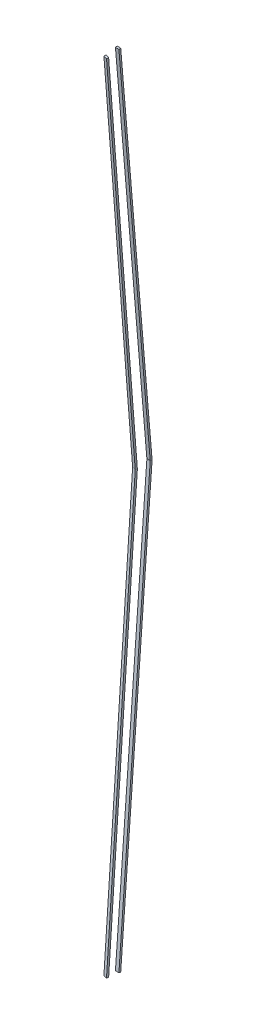
ISO-10303-21;
HEADER;
FILE_DESCRIPTION(('STEP AP214'),'2;1');
FILE_NAME('part.step','',(''),(''),'','','');
FILE_SCHEMA(('AUTOMOTIVE_DESIGN { 1 0 10303 214 1 1 1 1 }'));
ENDSEC;
DATA;
#1=APPLICATION_CONTEXT('core data for automotive mechanical design processes');
#2=APPLICATION_PROTOCOL_DEFINITION('international standard','automotive_design',2000,#1);
#3=PRODUCT_CONTEXT('',#1,'mechanical');
#4=PRODUCT('Part','Part','',(#3));
#5=PRODUCT_RELATED_PRODUCT_CATEGORY('part','',(#4));
#6=PRODUCT_DEFINITION_FORMATION('','',#4);
#7=PRODUCT_DEFINITION_CONTEXT('part definition',#1,'design');
#8=PRODUCT_DEFINITION('design','',#6,#7);
#9=PRODUCT_DEFINITION_SHAPE('','',#8);
#10=(LENGTH_UNIT() NAMED_UNIT(*) SI_UNIT(.MILLI.,.METRE.));
#11=(NAMED_UNIT(*) PLANE_ANGLE_UNIT() SI_UNIT($,.RADIAN.));
#12=(NAMED_UNIT(*) SI_UNIT($,.STERADIAN.) SOLID_ANGLE_UNIT());
#13=UNCERTAINTY_MEASURE_WITH_UNIT(LENGTH_MEASURE(1.E-05),#10,'distance_accuracy_value','');
#14=(GEOMETRIC_REPRESENTATION_CONTEXT(3) GLOBAL_UNCERTAINTY_ASSIGNED_CONTEXT((#13)) GLOBAL_UNIT_ASSIGNED_CONTEXT((#10,
#11,#12)) REPRESENTATION_CONTEXT('',''));
#15=CARTESIAN_POINT('',(0.,0.,0.));
#16=DIRECTION('',(0.,0.,1.));
#17=DIRECTION('',(1.,0.,0.));
#18=AXIS2_PLACEMENT_3D('',#15,#16,#17);
#19=CARTESIAN_POINT('',(-152.237738264979,320.160231668811,42.3905720206934));
#20=DIRECTION('',(3.86128822318415E-12,0.990268068743646,0.1391731009453));
#21=DIRECTION('',(0.,0.1391731009453,-0.990268068743646));
#22=AXIS2_PLACEMENT_3D('',#19,#20,#21);
#23=PLANE('',#22);
#24=DIRECTION('',(0.23455155219263,0.135290683936723,-0.962643236201222));
#25=VECTOR('',#24,1.);
#26=CARTESIAN_POINT('',(-156.061787395011,319.838365349823,44.6807698814717));
#27=LINE('',#26,#25);
#28=CARTESIAN_POINT('',(-156.061787395011,319.838365349823,44.6807698814717));
#29=VERTEX_POINT('',#28);
#30=CARTESIAN_POINT('',(-155.316943565859,320.267995553205,41.6237921405165));
#31=VERTEX_POINT('',#30);
#32=EDGE_CURVE('E211',#29,#31,#27,.T.);
#33=ORIENTED_EDGE('',*,*,#32,.F.);
#34=CARTESIAN_POINT('',(-156.061787395011,319.838365349823,44.6807698814717));
#35=CARTESIAN_POINT('',(-155.53406566862,319.819656879237,44.8138875666285));
#36=CARTESIAN_POINT('',(-155.006125952786,319.801070737595,44.9461348361269));
#37=CARTESIAN_POINT('',(-152.953214172442,319.729307720212,45.4567552371992));
#38=CARTESIAN_POINT('',(-151.426648614079,319.676982817079,45.8290662686723));
#39=CARTESIAN_POINT('',(-149.898323811749,319.625661630601,46.1942354850572));
#40=B_SPLINE_CURVE_WITH_KNOTS('',3,(#34,#35,#36,#37,#38,#39),.UNSPECIFIED.,.F.,.F.,(4,2,4),
(3.46673401728531,3.53112075735775,3.71700152562739),.UNSPECIFIED.);
#41=CARTESIAN_POINT('',(-149.898323811749,319.625661630601,46.1942354850572));
#42=VERTEX_POINT('',#41);
#43=EDGE_CURVE('E188',#29,#42,#40,.T.);
#44=ORIENTED_EDGE('',*,*,#43,.T.);
#45=DIRECTION('',(0.234551552192062,0.135290683936786,-0.962643236201351));
#46=VECTOR('',#45,1.);
#47=CARTESIAN_POINT('',(-149.898323811749,319.625661630601,46.1942354850572));
#48=LINE('',#47,#46);
#49=CARTESIAN_POINT('',(-149.153622633539,320.0552095521,43.1378432101179));
#50=VERTEX_POINT('',#49);
#51=EDGE_CURVE('E199',#42,#50,#48,.T.);
#52=ORIENTED_EDGE('',*,*,#51,.T.);
#53=CARTESIAN_POINT('',(-155.316943565859,320.267995553205,41.6237921405165));
#54=CARTESIAN_POINT('',(-153.265770191254,320.195241555838,42.141463730562));
#55=CARTESIAN_POINT('',(-151.211343115558,320.124307859224,42.6461832077424));
#56=CARTESIAN_POINT('',(-149.153622633539,320.0552095521,43.1378432101179));
#57=B_SPLINE_CURVE_WITH_KNOTS('',3,(#53,#54,#55,#56),.UNSPECIFIED.,.F.,.F.,(4,4),
(3.46513247858125,3.71700152562739),.UNSPECIFIED.);
#58=EDGE_CURVE('E206',#31,#50,#57,.T.);
#59=ORIENTED_EDGE('',*,*,#58,.F.);
#60=EDGE_LOOP('',(#33,#44,#52,#59));
#61=FACE_BOUND('',#60,.T.);
#62=ADVANCED_FACE('F144',(#61),#23,.T.);
#63=CARTESIAN_POINT('',(-201.824302837777,-390.348529640337,-58.4461827906793));
#64=DIRECTION('',(0.,1.,0.));
#65=DIRECTION('',(0.,0.,-1.));
#66=AXIS2_PLACEMENT_3D('',#63,#64,#65);
#67=PLANE('',#66);
#68=DIRECTION('',(0.237326491207853,0.,-0.971429944242491));
#69=VECTOR('',#68,1.);
#70=CARTESIAN_POINT('',(-205.660848265567,-390.348529640337,-56.1398266287337));
#71=LINE('',#70,#69);
#72=CARTESIAN_POINT('',(-205.660848265567,-390.348529640337,-56.1398266287337));
#73=VERTEX_POINT('',#72);
#74=CARTESIAN_POINT('',(-204.907300304975,-390.348529640337,-59.2242654944347));
#75=VERTEX_POINT('',#74);
#76=EDGE_CURVE('E290',#73,#75,#71,.T.);
#77=ORIENTED_EDGE('',*,*,#76,.T.);
#78=CARTESIAN_POINT('',(-204.907300304975,-390.348529640337,-59.2242654944347));
#79=CARTESIAN_POINT('',(-202.850160939919,-390.348529640337,-58.7016411425626));
#80=CARTESIAN_POINT('',(-200.796637160963,-390.348529640337,-58.1852697945496));
#81=CARTESIAN_POINT('',(-198.746728094591,-390.348529640337,-57.6844640196631));
#82=B_SPLINE_CURVE_WITH_KNOTS('',3,(#78,#79,#80,#81),.UNSPECIFIED.,.F.,.F.,(4,4),
(5.14385179955999,5.39514400114973),.UNSPECIFIED.);
#83=CARTESIAN_POINT('',(-198.746728094591,-390.348529640337,-57.6844640196631));
#84=VERTEX_POINT('',#83);
#85=EDGE_CURVE('E284',#75,#84,#82,.T.);
#86=ORIENTED_EDGE('',*,*,#85,.T.);
#87=DIRECTION('',(0.237326491188107,0.,-0.971429944247315));
#88=VECTOR('',#87,1.);
#89=CARTESIAN_POINT('',(-199.500239704113,-390.348529640337,-54.6001739466776));
#90=LINE('',#89,#88);
#91=CARTESIAN_POINT('',(-199.500239704115,-390.348529640337,-54.600173946678));
#92=VERTEX_POINT('',#91);
#93=EDGE_CURVE('E155',#92,#84,#90,.T.);
#94=ORIENTED_EDGE('',*,*,#93,.F.);
#95=CARTESIAN_POINT('',(-205.660848265567,-390.348529640337,-56.1398266287337));
#96=CARTESIAN_POINT('',(-203.60810992003,-390.348529640337,-55.6183663203144));
#97=CARTESIAN_POINT('',(-201.554588896225,-390.348529640337,-55.102064472419));
#98=CARTESIAN_POINT('',(-199.500239704115,-390.348529640337,-54.600173946678));
#99=B_SPLINE_CURVE_WITH_KNOTS('',3,(#95,#96,#97,#98),.UNSPECIFIED.,.F.,.F.,(4,4),
(5.14499955782916,5.39514400114973),.UNSPECIFIED.);
#100=EDGE_CURVE('E14',#73,#92,#99,.T.);
#101=ORIENTED_EDGE('',*,*,#100,.F.);
#102=EDGE_LOOP('',(#77,#86,#94,#101));
#103=FACE_BOUND('',#102,.T.);
#104=ADVANCED_FACE('F250',(#103),#67,.F.);
#105=CARTESIAN_POINT('',(-205.660848265567,-390.348529640337,-56.1398266287337));
#106=CARTESIAN_POINT('',(-156.061787395011,319.838365349823,44.6807698814717));
#107=CARTESIAN_POINT('',(-205.535256938801,-390.348529640337,-56.6538997730172));
#108=CARTESIAN_POINT('',(-155.937646756819,319.90997038372,44.1712735913124));
#109=CARTESIAN_POINT('',(-205.409665612036,-390.348529640337,-57.1679729173007));
#110=CARTESIAN_POINT('',(-155.813506118627,319.981575417617,43.6617773011532));
#111=CARTESIAN_POINT('',(-205.158482958505,-390.348529640337,-58.1961192058677));
#112=CARTESIAN_POINT('',(-155.565224842243,320.124785485411,42.6427847208348));
#113=CARTESIAN_POINT('',(-205.03289163174,-390.348529640337,-58.7101923501512));
#114=CARTESIAN_POINT('',(-155.441084204051,320.196390519308,42.1332884306756));
#115=CARTESIAN_POINT('',(-204.907300304975,-390.348529640337,-59.2242654944347));
#116=CARTESIAN_POINT('',(-155.316943565859,320.267995553205,41.6237921405165));
#117=B_SPLINE_SURFACE_WITH_KNOTS('',3,1,((#105,#106),(#107,#108),(#109,#110),(#111,#112),(#113,
#114),(#115,#116)),.UNSPECIFIED.,.F.,.F.,.F.,(4,2,4),(2,2),(0.,0.5,1.),(0.,1.),.UNSPECIFIED.);
#118=DIRECTION('',(-0.0689814409750572,-0.987714576005323,-0.140219389342662));
#119=VECTOR('',#118,1.);
#120=CARTESIAN_POINT('',(-180.861317830289,-35.2550821452571,-5.72952837363101));
#121=LINE('',#120,#119);
#122=EDGE_CURVE('E179',#29,#73,#121,.T.);
#123=DIRECTION('',(0.0689283435027476,0.987724694237461,0.140174219653553));
#124=VECTOR('',#123,1.);
#125=CARTESIAN_POINT('',(-180.112121935417,-35.0402670435662,-8.80023667695908));
#126=LINE('',#125,#124);
#127=EDGE_CURVE('E164',#75,#31,#126,.T.);
#128=ORIENTED_EDGE('',*,*,#76,.F.);
#129=ORIENTED_EDGE('',*,*,#122,.F.);
#130=ORIENTED_EDGE('',*,*,#32,.T.);
#131=ORIENTED_EDGE('',*,*,#127,.F.);
#132=EDGE_LOOP('',(#128,#129,#130,#131));
#133=FACE_BOUND('',#132,.T.);
#134=ADVANCED_FACE('F259',(#133),#117,.F.);
#135=CARTESIAN_POINT('',(-204.907300304975,-390.348529640337,-59.2242654944347));
#136=CARTESIAN_POINT('',(-155.316943565859,320.267995553205,41.6237921405165));
#137=CARTESIAN_POINT('',(-203.881526156514,-390.348529640337,-58.9636635349306));
#138=CARTESIAN_POINT('',(-154.291347612634,320.231618225864,41.8826302740567));
#139=CARTESIAN_POINT('',(-202.855350610006,-390.348529640337,-58.7046735299587));
#140=CARTESIAN_POINT('',(-153.264940707668,320.195696754155,42.1382248262377));
#141=CARTESIAN_POINT('',(-200.802196720892,-390.348529640337,-58.1899174290792));
#142=CARTESIAN_POINT('',(-151.210504994252,320.124765522,42.6429267678813));
#143=CARTESIAN_POINT('',(-199.774848197273,-390.348529640337,-57.9356402757939));
#144=CARTESIAN_POINT('',(-150.182471588445,320.089758326674,42.8920159055674));
#145=CARTESIAN_POINT('',(-198.746728094591,-390.348529640337,-57.6844640196631));
#146=CARTESIAN_POINT('',(-149.153622633539,320.0552095521,43.1378432101179));
#147=B_SPLINE_SURFACE_WITH_KNOTS('',3,1,((#135,#136),(#137,#138),(#139,#140),(#141,#142),(#143,
#144),(#145,#146)),.UNSPECIFIED.,.F.,.F.,.F.,(4,2,4),(2,2),(0.,0.5,1.),(0.,1.),.UNSPECIFIED.);
#148=DIRECTION('',(0.0689526351551819,0.987722171983838,0.140180045215732));
#149=VECTOR('',#148,1.);
#150=CARTESIAN_POINT('',(-173.950175364065,-35.1466600441185,-7.27331040477257));
#151=LINE('',#150,#149);
#152=EDGE_CURVE('E196',#84,#50,#151,.T.);
#153=ORIENTED_EDGE('',*,*,#85,.F.);
#154=ORIENTED_EDGE('',*,*,#127,.T.);
#155=ORIENTED_EDGE('',*,*,#58,.T.);
#156=ORIENTED_EDGE('',*,*,#152,.F.);
#157=EDGE_LOOP('',(#153,#154,#155,#156));
#158=FACE_BOUND('',#157,.T.);
#159=ADVANCED_FACE('F333',(#158),#147,.F.);
#160=CARTESIAN_POINT('',(-199.500239704115,-390.348529640337,-54.600173946678));
#161=CARTESIAN_POINT('',(-149.898323811749,319.625661630601,46.1942354850572));
#162=CARTESIAN_POINT('',(-200.528360133361,-390.348529640337,-54.8513502825908));
#163=CARTESIAN_POINT('',(-150.927179241401,319.660210622598,45.9484066334631));
#164=CARTESIAN_POINT('',(-201.555713745134,-390.348529640337,-55.1056081298554));
#165=CARTESIAN_POINT('',(-151.955232248758,319.695208583692,45.699383200744));
#166=CARTESIAN_POINT('',(-203.608887333733,-390.348529640337,-55.6202868470884));
#167=CARTESIAN_POINT('',(-154.00973341888,319.766102444078,45.1949471730558));
#168=CARTESIAN_POINT('',(-204.635069909111,-390.348529640337,-55.879246560509));
#169=CARTESIAN_POINT('',(-155.036168272611,319.802005722723,44.9394820712464));
#170=CARTESIAN_POINT('',(-205.660848265567,-390.348529640337,-56.1398266287337));
#171=CARTESIAN_POINT('',(-156.061787395011,319.838365349823,44.6807698814717));
#172=B_SPLINE_SURFACE_WITH_KNOTS('',3,1,((#160,#161),(#162,#163),(#164,#165),(#166,#167),(#168,
#169),(#170,#171)),.UNSPECIFIED.,.F.,.F.,.F.,(4,2,4),(2,2),(0.,0.5,1.),(0.,1.),.UNSPECIFIED.);
#173=DIRECTION('',(0.0690059080028812,0.987712124539221,0.140224618733363));
#174=VECTOR('',#173,1.);
#175=CARTESIAN_POINT('',(-174.699281757931,-35.3614340048681,-4.20296923081019));
#176=LINE('',#175,#174);
#177=EDGE_CURVE('E184',#92,#42,#176,.T.);
#178=ORIENTED_EDGE('',*,*,#100,.T.);
#179=ORIENTED_EDGE('',*,*,#177,.T.);
#180=ORIENTED_EDGE('',*,*,#43,.F.);
#181=ORIENTED_EDGE('',*,*,#122,.T.);
#182=EDGE_LOOP('',(#178,#179,#180,#181));
#183=FACE_BOUND('',#182,.T.);
#184=ADVANCED_FACE('F186',(#183),#172,.F.);
#185=CARTESIAN_POINT('',(-198.746728094591,-390.348529640337,-57.6844640196631));
#186=CARTESIAN_POINT('',(-149.153622633539,320.0552095521,43.1378432101179));
#187=CARTESIAN_POINT('',(-198.872313362844,-390.348529640337,-57.1704156741655));
#188=CARTESIAN_POINT('',(-149.277739496574,319.98361823185,43.6472419226078));
#189=CARTESIAN_POINT('',(-198.997898631098,-390.348529640337,-56.6563673286679));
#190=CARTESIAN_POINT('',(-149.401856359609,319.9120269116,44.1566406350976));
#191=CARTESIAN_POINT('',(-199.249069167606,-390.348529640337,-55.6282706376728));
#192=CARTESIAN_POINT('',(-149.650090085679,319.768844271101,45.1754380600774));
#193=CARTESIAN_POINT('',(-199.374654435859,-390.348529640337,-55.1142222921752));
#194=CARTESIAN_POINT('',(-149.774206948714,319.69725295085,45.6848367725673));
#195=CARTESIAN_POINT('',(-199.500239704113,-390.348529640337,-54.6001739466776));
#196=CARTESIAN_POINT('',(-149.898323811749,319.625661630601,46.1942354850572));
#197=B_SPLINE_SURFACE_WITH_KNOTS('',3,1,((#185,#186),(#187,#188),(#189,#190),(#191,#192),(#193,
#194),(#195,#196)),.UNSPECIFIED.,.F.,.F.,.F.,(4,2,4),(2,2),(0.,0.5,1.),(0.,1.),.UNSPECIFIED.);
#198=ORIENTED_EDGE('',*,*,#93,.T.);
#199=ORIENTED_EDGE('',*,*,#152,.T.);
#200=ORIENTED_EDGE('',*,*,#51,.F.);
#201=ORIENTED_EDGE('',*,*,#177,.F.);
#202=EDGE_LOOP('',(#198,#199,#200,#201));
#203=FACE_BOUND('',#202,.T.);
#204=ADVANCED_FACE('F201',(#203),#197,.F.);
#205=CLOSED_SHELL('',(#62,#104,#134,#159,#184,#204));
#206=MANIFOLD_SOLID_BREP('B2',#205);
#207=CARTESIAN_POINT('',(-153.140507570127,322.756182568553,23.9194215879336));
#208=DIRECTION('',(-7.40505947866751E-13,-0.990268068746311,-0.139173100926337));
#209=DIRECTION('',(0.,-0.139173100926337,0.990268068746311));
#210=AXIS2_PLACEMENT_3D('',#207,#208,#209);
#211=PLANE('',#210);
#212=DIRECTION('',(-0.0214353868944192,-0.139141123950179,0.990040540490422));
#213=VECTOR('',#212,1.);
#214=CARTESIAN_POINT('',(-149.898323811758,323.188063599809,20.8464283744718));
#215=LINE('',#214,#213);
#216=CARTESIAN_POINT('',(-149.898323811758,323.188063599809,20.8464283744718));
#217=VERTEX_POINT('',#216);
#218=CARTESIAN_POINT('',(-149.966381165148,322.746290531268,23.9898070905284));
#219=VERTEX_POINT('',#218);
#220=EDGE_CURVE('E559',#217,#219,#215,.T.);
#221=ORIENTED_EDGE('',*,*,#220,.F.);
#222=CARTESIAN_POINT('',(-149.898323811758,323.188063599809,20.8464283744718));
#223=CARTESIAN_POINT('',(-152.014492368924,323.194378066617,20.8014986085389));
#224=CARTESIAN_POINT('',(-154.130594049607,323.201249849024,20.7526033360559));
#225=CARTESIAN_POINT('',(-156.246603060116,323.208706163198,20.6995489039482));
#226=B_SPLINE_CURVE_WITH_KNOTS('',3,(#222,#223,#224,#225),.UNSPECIFIED.,.F.,.F.,(4,4),
(16.9060793124062,17.1560011004309),.UNSPECIFIED.);
#227=CARTESIAN_POINT('',(-156.246603060116,323.208706163198,20.6995489039482));
#228=VERTEX_POINT('',#227);
#229=EDGE_CURVE('E565',#217,#228,#226,.T.);
#230=ORIENTED_EDGE('',*,*,#229,.T.);
#231=DIRECTION('',(-0.0214353868952497,-0.139141123950234,0.990040540490397));
#232=VECTOR('',#231,1.);
#233=CARTESIAN_POINT('',(-156.246603060116,323.208706163198,20.6995489039482));
#234=LINE('',#233,#232);
#235=CARTESIAN_POINT('',(-156.314660926212,322.766929766595,23.8429513003828));
#236=VERTEX_POINT('',#235);
#237=EDGE_CURVE('E573',#228,#236,#234,.T.);
#238=ORIENTED_EDGE('',*,*,#237,.T.);
#239=CARTESIAN_POINT('',(-149.966381165148,322.746290531268,23.9898070905284));
#240=CARTESIAN_POINT('',(-152.08245217296,322.752604706996,23.9448793957298));
#241=CARTESIAN_POINT('',(-154.198553983593,322.759475376525,23.8959920417892));
#242=CARTESIAN_POINT('',(-156.314660926212,322.766929766595,23.8429513003828));
#243=B_SPLINE_CURVE_WITH_KNOTS('',3,(#239,#240,#241,#242),.UNSPECIFIED.,.F.,.F.,(4,4),
(16.9060793124062,17.1555176068426),.UNSPECIFIED.);
#244=EDGE_CURVE('E578',#219,#236,#243,.T.);
#245=ORIENTED_EDGE('',*,*,#244,.F.);
#246=EDGE_LOOP('',(#221,#230,#238,#245));
#247=FACE_BOUND('',#246,.T.);
#248=ADVANCED_FACE('F510',(#247),#211,.F.);
#249=CARTESIAN_POINT('',(-202.669192099467,-390.348529640337,-84.9138171812578));
#250=DIRECTION('',(0.,-1.,0.));
#251=DIRECTION('',(0.,0.,1.));
#252=AXIS2_PLACEMENT_3D('',#249,#250,#251);
#253=PLANE('',#252);
#254=DIRECTION('',(0.0588207490144278,0.,-0.998268560801842));
#255=VECTOR('',#254,1.);
#256=CARTESIAN_POINT('',(-199.686995582296,-390.348529640337,-81.5523324363946));
#257=LINE('',#256,#255);
#258=CARTESIAN_POINT('',(-199.686995582296,-390.348529640337,-81.5523324363946));
#259=VERTEX_POINT('',#258);
#260=CARTESIAN_POINT('',(-199.500239704175,-390.348529640337,-84.7218351169399));
#261=VERTEX_POINT('',#260);
#262=EDGE_CURVE('E562',#259,#261,#257,.T.);
#263=ORIENTED_EDGE('',*,*,#262,.F.);
#264=CARTESIAN_POINT('',(-199.686995582296,-390.348529640337,-81.5523324363946));
#265=CARTESIAN_POINT('',(-201.800280390277,-390.348529640337,-81.6768530315202));
#266=CARTESIAN_POINT('',(-203.913024823059,-390.348529640337,-81.8105413754247));
#267=CARTESIAN_POINT('',(-206.024578484168,-390.348529640337,-81.9499852711155));
#268=B_SPLINE_CURVE_WITH_KNOTS('',3,(#264,#265,#266,#267),.UNSPECIFIED.,.F.,.F.,(4,4),
(24.9150323256318,25.164217691229),.UNSPECIFIED.);
#269=CARTESIAN_POINT('',(-206.024578484168,-390.348529640337,-81.9499852711155));
#270=VERTEX_POINT('',#269);
#271=EDGE_CURVE('E142',#259,#270,#268,.T.);
#272=ORIENTED_EDGE('',*,*,#271,.T.);
#273=DIRECTION('',(0.0588207490143727,0.,-0.998268560801846));
#274=VECTOR('',#273,1.);
#275=CARTESIAN_POINT('',(-206.024578484168,-390.348529640337,-81.9499852711155));
#276=LINE('',#275,#274);
#277=CARTESIAN_POINT('',(-205.837870398832,-390.348529640337,-85.1186768427457));
#278=VERTEX_POINT('',#277);
#279=EDGE_CURVE('E521',#270,#278,#276,.T.);
#280=ORIENTED_EDGE('',*,*,#279,.T.);
#281=CARTESIAN_POINT('',(-199.500239704175,-390.348529640337,-84.7218351169399));
#282=CARTESIAN_POINT('',(-201.612912424974,-390.348529640337,-84.8463196461934));
#283=CARTESIAN_POINT('',(-203.725563139268,-390.348529640337,-84.9770221839322));
#284=CARTESIAN_POINT('',(-205.837870398832,-390.348529640337,-85.1186768427457));
#285=B_SPLINE_CURVE_WITH_KNOTS('',3,(#281,#282,#283,#284),.UNSPECIFIED.,.F.,.F.,(4,4),
(24.9150323256318,25.1648764359603),.UNSPECIFIED.);
#286=EDGE_CURVE('E671',#261,#278,#285,.T.);
#287=ORIENTED_EDGE('',*,*,#286,.F.);
#288=EDGE_LOOP('',(#263,#272,#280,#287));
#289=FACE_BOUND('',#288,.T.);
#290=ADVANCED_FACE('F735',(#289),#253,.T.);
#291=CARTESIAN_POINT('',(-199.686995582296,-390.348529640337,-81.5523324363946));
#292=CARTESIAN_POINT('',(-149.966381165148,322.746290531268,23.9898070905284));
#293=CARTESIAN_POINT('',(-200.743509782737,-390.348529640337,-81.6145851798491));
#294=CARTESIAN_POINT('',(-151.024475127435,322.749447793566,23.9673420019608));
#295=CARTESIAN_POINT('',(-201.799890015471,-390.348529640337,-81.6789888654246));
#296=CARTESIAN_POINT('',(-152.082545613498,322.752745231326,23.9438795131623));
#297=CARTESIAN_POINT('',(-203.912382545523,-390.348529640337,-81.812098120817));
#298=CARTESIAN_POINT('',(-154.198639633173,322.759620457768,23.8949597351037));
#299=CARTESIAN_POINT('',(-204.968529946747,-390.348529640337,-81.8802453801486));
#300=CARTESIAN_POINT('',(-155.256662400799,322.763202765118,23.8694702938536));
#301=CARTESIAN_POINT('',(-206.024578484168,-390.348529640337,-81.9499852711155));
#302=CARTESIAN_POINT('',(-156.314660926212,322.766929766595,23.8429513003828));
#303=B_SPLINE_SURFACE_WITH_KNOTS('',3,1,((#291,#292),(#293,#294),(#295,#296),(#297,#298),(#299,
#300),(#301,#302)),.UNSPECIFIED.,.F.,.F.,.F.,(4,2,4),(2,2),(0.,0.5,1.),(0.,1.),.UNSPECIFIED.);
#304=DIRECTION('',(-0.0688102588261489,-0.986879179165405,-0.146063801162691));
#305=VECTOR('',#304,1.);
#306=CARTESIAN_POINT('',(-174.826688373722,-33.8011195545347,-28.7812626729331));
#307=LINE('',#306,#305);
#308=EDGE_CURVE('E667',#219,#259,#307,.T.);
#309=DIRECTION('',(0.0687900945897061,0.986830844142769,0.146399480650748));
#310=VECTOR('',#309,1.);
#311=CARTESIAN_POINT('',(-181.16961970519,-33.7907999368707,-29.0535169853663));
#312=LINE('',#311,#310);
#313=EDGE_CURVE('E530',#270,#236,#312,.T.);
#314=ORIENTED_EDGE('',*,*,#271,.F.);
#315=ORIENTED_EDGE('',*,*,#308,.F.);
#316=ORIENTED_EDGE('',*,*,#244,.T.);
#317=ORIENTED_EDGE('',*,*,#313,.F.);
#318=EDGE_LOOP('',(#314,#315,#316,#317));
#319=FACE_BOUND('',#318,.T.);
#320=ADVANCED_FACE('F641',(#319),#303,.F.);
#321=CARTESIAN_POINT('',(-206.024578484168,-390.348529640337,-81.9499852711155));
#322=CARTESIAN_POINT('',(-156.314660926212,322.766929766595,23.8429513003828));
#323=CARTESIAN_POINT('',(-205.993460469945,-390.348529640337,-82.4781005330538));
#324=CARTESIAN_POINT('',(-156.30331794853,322.840559166029,23.3190509009771));
#325=CARTESIAN_POINT('',(-205.962342455722,-390.348529640337,-83.0062157949922));
#326=CARTESIAN_POINT('',(-156.291974970847,322.914188565463,22.7951505015714));
#327=CARTESIAN_POINT('',(-205.900106427277,-390.348529640337,-84.062446318869));
#328=CARTESIAN_POINT('',(-156.269289015481,323.06144736433,21.7473497027598));
#329=CARTESIAN_POINT('',(-205.868988413054,-390.348529640337,-84.5905615808074));
#330=CARTESIAN_POINT('',(-156.257946037799,323.135076763764,21.223449303354));
#331=CARTESIAN_POINT('',(-205.837870398832,-390.348529640337,-85.1186768427457));
#332=CARTESIAN_POINT('',(-156.246603060116,323.208706163198,20.6995489039482));
#333=B_SPLINE_SURFACE_WITH_KNOTS('',3,1,((#321,#322),(#323,#324),(#325,#326),(#327,#328),(#329,
#330),(#331,#332)),.UNSPECIFIED.,.F.,.F.,.F.,(4,2,4),(2,2),(0.,0.5,1.),(0.,1.),.UNSPECIFIED.);
#334=DIRECTION('',(0.0685849477196162,0.986852894447658,0.146347086293429));
#335=VECTOR('',#334,1.);
#336=CARTESIAN_POINT('',(-181.042236729474,-33.5699117385697,-32.2095639693988));
#337=LINE('',#336,#335);
#338=EDGE_CURVE('E550',#278,#228,#337,.T.);
#339=ORIENTED_EDGE('',*,*,#279,.F.);
#340=ORIENTED_EDGE('',*,*,#313,.T.);
#341=ORIENTED_EDGE('',*,*,#237,.F.);
#342=ORIENTED_EDGE('',*,*,#338,.F.);
#343=EDGE_LOOP('',(#339,#340,#341,#342));
#344=FACE_BOUND('',#343,.T.);
#345=ADVANCED_FACE('F616',(#344),#333,.F.);
#346=CARTESIAN_POINT('',(-199.500239704175,-390.348529640337,-84.7218351169399));
#347=CARTESIAN_POINT('',(-149.898323811758,323.188063599809,20.8464283744718));
#348=CARTESIAN_POINT('',(-199.531365683862,-390.348529640337,-84.1935846701824));
#349=CARTESIAN_POINT('',(-149.90966670399,323.114434755052,21.3703248271479));
#350=CARTESIAN_POINT('',(-199.562491663548,-390.348529640337,-83.6653342234248));
#351=CARTESIAN_POINT('',(-149.921009596221,323.040805910295,21.894221279824));
#352=CARTESIAN_POINT('',(-199.624743622922,-390.348529640337,-82.6088333299097));
#353=CARTESIAN_POINT('',(-149.943695380685,322.893548220781,22.9420141851762));
#354=CARTESIAN_POINT('',(-199.655869602609,-390.348529640337,-82.0805828831521));
#355=CARTESIAN_POINT('',(-149.955038272916,322.819919376024,23.4659106378523));
#356=CARTESIAN_POINT('',(-199.686995582296,-390.348529640337,-81.5523324363946));
#357=CARTESIAN_POINT('',(-149.966381165148,322.746290531268,23.9898070905284));
#358=B_SPLINE_SURFACE_WITH_KNOTS('',3,1,((#346,#347),(#348,#349),(#350,#351),(#352,#353),(#354,
#355),(#356,#357)),.UNSPECIFIED.,.F.,.F.,.F.,(4,2,4),(2,2),(0.,0.5,1.),(0.,1.),.UNSPECIFIED.);
#359=DIRECTION('',(0.0686050052000333,0.986901026077874,0.146012732280248));
#360=VECTOR('',#359,1.);
#361=CARTESIAN_POINT('',(-174.699281757966,-33.5802330202638,-31.9377033712341));
#362=LINE('',#361,#360);
#363=EDGE_CURVE('E556',#261,#217,#362,.T.);
#364=ORIENTED_EDGE('',*,*,#262,.T.);
#365=ORIENTED_EDGE('',*,*,#363,.T.);
#366=ORIENTED_EDGE('',*,*,#220,.T.);
#367=ORIENTED_EDGE('',*,*,#308,.T.);
#368=EDGE_LOOP('',(#364,#365,#366,#367));
#369=FACE_BOUND('',#368,.T.);
#370=ADVANCED_FACE('F557',(#369),#358,.F.);
#371=CARTESIAN_POINT('',(-205.837870398832,-390.348529640337,-85.1186768427457));
#372=CARTESIAN_POINT('',(-156.246603060116,323.208706163198,20.6995489039482));
#373=CARTESIAN_POINT('',(-204.781894495133,-390.348529640337,-85.0478614319306));
#374=CARTESIAN_POINT('',(-155.188605013559,323.20497802887,20.7260759580639));
#375=CARTESIAN_POINT('',(-203.725758335003,-390.348529640337,-84.9795805392148));
#376=CARTESIAN_POINT('',(-154.130582530547,323.201394883868,20.7515713595181));
#377=CARTESIAN_POINT('',(-201.613165501885,-390.348529640337,-84.8480877899818));
#378=CARTESIAN_POINT('',(-152.014488691615,323.194518572518,20.8004988571032));
#379=CARTESIAN_POINT('',(-200.556758097128,-390.348529640337,-84.784088107429));
#380=CARTESIAN_POINT('',(-150.95641809184,323.191220863057,20.8239632791569));
#381=CARTESIAN_POINT('',(-199.500239704175,-390.348529640337,-84.7218351169399));
#382=CARTESIAN_POINT('',(-149.898323811758,323.188063599809,20.8464283744718));
#383=B_SPLINE_SURFACE_WITH_KNOTS('',3,1,((#371,#372),(#373,#374),(#375,#376),(#377,#378),(#379,
#380),(#381,#382)),.UNSPECIFIED.,.F.,.F.,.F.,(4,2,4),(2,2),(0.,0.5,1.),(0.,1.),.UNSPECIFIED.);
#384=ORIENTED_EDGE('',*,*,#286,.T.);
#385=ORIENTED_EDGE('',*,*,#338,.T.);
#386=ORIENTED_EDGE('',*,*,#229,.F.);
#387=ORIENTED_EDGE('',*,*,#363,.F.);
#388=EDGE_LOOP('',(#384,#385,#386,#387));
#389=FACE_BOUND('',#388,.T.);
#390=ADVANCED_FACE('F569',(#389),#383,.F.);
#391=CLOSED_SHELL('',(#248,#290,#320,#345,#370,#390));
#392=MANIFOLD_SOLID_BREP('B8',#391);
#393=CARTESIAN_POINT('',(-153.140507570127,-1103.45324184923,23.9194215879336));
#394=DIRECTION('',(-7.40505947866751E-13,0.990268068746311,-0.139173100926337));
#395=DIRECTION('',(0.,0.139173100926337,0.990268068746311));
#396=AXIS2_PLACEMENT_3D('',#393,#394,#395);
#397=PLANE('',#396);
#398=DIRECTION('',(-0.0214353868944192,0.139141123950179,0.990040540490422));
#399=VECTOR('',#398,1.);
#400=CARTESIAN_POINT('',(-149.898323811758,-1103.88512288048,20.8464283744718));
#401=LINE('',#400,#399);
#402=CARTESIAN_POINT('',(-149.898323811758,-1103.88512288048,20.8464283744718));
#403=VERTEX_POINT('',#402);
#404=CARTESIAN_POINT('',(-149.966381165148,-1103.44334981194,23.9898070905284));
#405=VERTEX_POINT('',#404);
#406=EDGE_CURVE('E921',#403,#405,#401,.T.);
#407=ORIENTED_EDGE('',*,*,#406,.T.);
#408=CARTESIAN_POINT('',(-149.966381165148,-1103.44334981194,23.9898070905284));
#409=CARTESIAN_POINT('',(-152.08245217296,-1103.44966398767,23.9448793957298));
#410=CARTESIAN_POINT('',(-154.198553983593,-1103.4565346572,23.8959920417892));
#411=CARTESIAN_POINT('',(-156.314660926212,-1103.46398904727,23.8429513003828));
#412=B_SPLINE_CURVE_WITH_KNOTS('',3,(#408,#409,#410,#411),.UNSPECIFIED.,.F.,.F.,(4,4),
(16.9060793124062,17.1555176068426),.UNSPECIFIED.);
#413=CARTESIAN_POINT('',(-156.314660926212,-1103.46398904727,23.8429513003828));
#414=VERTEX_POINT('',#413);
#415=EDGE_CURVE('E940',#405,#414,#412,.T.);
#416=ORIENTED_EDGE('',*,*,#415,.T.);
#417=DIRECTION('',(-0.0214353868952497,0.139141123950234,0.990040540490397));
#418=VECTOR('',#417,1.);
#419=CARTESIAN_POINT('',(-156.246603060116,-1103.90576544387,20.6995489039482));
#420=LINE('',#419,#418);
#421=CARTESIAN_POINT('',(-156.246603060116,-1103.90576544387,20.6995489039482));
#422=VERTEX_POINT('',#421);
#423=EDGE_CURVE('E922',#422,#414,#420,.T.);
#424=ORIENTED_EDGE('',*,*,#423,.F.);
#425=CARTESIAN_POINT('',(-149.898323811758,-1103.88512288048,20.8464283744718));
#426=CARTESIAN_POINT('',(-152.014492368924,-1103.89143734729,20.8014986085389));
#427=CARTESIAN_POINT('',(-154.130594049607,-1103.8983091297,20.7526033360559));
#428=CARTESIAN_POINT('',(-156.246603060116,-1103.90576544387,20.6995489039482));
#429=B_SPLINE_CURVE_WITH_KNOTS('',3,(#425,#426,#427,#428),.UNSPECIFIED.,.F.,.F.,(4,4),
(16.9060793124062,17.1560011004309),.UNSPECIFIED.);
#430=EDGE_CURVE('E917',#403,#422,#429,.T.);
#431=ORIENTED_EDGE('',*,*,#430,.F.);
#432=EDGE_LOOP('',(#407,#416,#424,#431));
#433=FACE_BOUND('',#432,.T.);
#434=ADVANCED_FACE('F875',(#433),#397,.F.);
#435=CARTESIAN_POINT('',(-202.669192099467,-390.348529640337,-84.9138171812578));
#436=DIRECTION('',(0.,1.,0.));
#437=DIRECTION('',(0.,0.,1.));
#438=AXIS2_PLACEMENT_3D('',#435,#436,#437);
#439=PLANE('',#438);
#440=DIRECTION('',(0.0588207490144278,0.,-0.998268560801842));
#441=VECTOR('',#440,1.);
#442=CARTESIAN_POINT('',(-199.686995582296,-390.348529640337,-81.5523324363946));
#443=LINE('',#442,#441);
#444=CARTESIAN_POINT('',(-199.686995582296,-390.348529640337,-81.5523324363946));
#445=VERTEX_POINT('',#444);
#446=CARTESIAN_POINT('',(-199.500239704175,-390.348529640337,-84.7218351169399));
#447=VERTEX_POINT('',#446);
#448=EDGE_CURVE('E957',#445,#447,#443,.T.);
#449=ORIENTED_EDGE('',*,*,#448,.T.);
#450=CARTESIAN_POINT('',(-199.500239704175,-390.348529640337,-84.7218351169399));
#451=CARTESIAN_POINT('',(-201.612912424974,-390.348529640337,-84.8463196461934));
#452=CARTESIAN_POINT('',(-203.725563139268,-390.348529640337,-84.9770221839322));
#453=CARTESIAN_POINT('',(-205.837870398832,-390.348529640337,-85.1186768427457));
#454=B_SPLINE_CURVE_WITH_KNOTS('',3,(#450,#451,#452,#453),.UNSPECIFIED.,.F.,.F.,(4,4),
(24.9150323256318,25.1648764359603),.UNSPECIFIED.);
#455=CARTESIAN_POINT('',(-205.837870398832,-390.348529640337,-85.1186768427457));
#456=VERTEX_POINT('',#455);
#457=EDGE_CURVE('E946',#447,#456,#454,.T.);
#458=ORIENTED_EDGE('',*,*,#457,.T.);
#459=DIRECTION('',(0.0588207490143727,0.,-0.998268560801846));
#460=VECTOR('',#459,1.);
#461=CARTESIAN_POINT('',(-206.024578484168,-390.348529640337,-81.9499852711155));
#462=LINE('',#461,#460);
#463=CARTESIAN_POINT('',(-206.024578484168,-390.348529640337,-81.9499852711155));
#464=VERTEX_POINT('',#463);
#465=EDGE_CURVE('E886',#464,#456,#462,.T.);
#466=ORIENTED_EDGE('',*,*,#465,.F.);
#467=CARTESIAN_POINT('',(-199.686995582296,-390.348529640337,-81.5523324363946));
#468=CARTESIAN_POINT('',(-201.800280390277,-390.348529640337,-81.6768530315202));
#469=CARTESIAN_POINT('',(-203.913024823059,-390.348529640337,-81.8105413754247));
#470=CARTESIAN_POINT('',(-206.024578484168,-390.348529640337,-81.9499852711155));
#471=B_SPLINE_CURVE_WITH_KNOTS('',3,(#467,#468,#469,#470),.UNSPECIFIED.,.F.,.F.,(4,4),
(24.9150323256318,25.164217691229),.UNSPECIFIED.);
#472=EDGE_CURVE('E508',#445,#464,#471,.T.);
#473=ORIENTED_EDGE('',*,*,#472,.F.);
#474=EDGE_LOOP('',(#449,#458,#466,#473));
#475=FACE_BOUND('',#474,.T.);
#476=ADVANCED_FACE('F1010',(#475),#439,.T.);
#477=CARTESIAN_POINT('',(-199.686995582296,-390.348529640337,-81.5523324363946));
#478=CARTESIAN_POINT('',(-149.966381165148,-1103.44334981194,23.9898070905284));
#479=CARTESIAN_POINT('',(-200.743509782737,-390.348529640337,-81.6145851798491));
#480=CARTESIAN_POINT('',(-151.024475127435,-1103.44650707424,23.9673420019608));
#481=CARTESIAN_POINT('',(-201.799890015471,-390.348529640337,-81.6789888654246));
#482=CARTESIAN_POINT('',(-152.082545613498,-1103.449804512,23.9438795131623));
#483=CARTESIAN_POINT('',(-203.912382545523,-390.348529640337,-81.812098120817));
#484=CARTESIAN_POINT('',(-154.198639633173,-1103.45667973844,23.8949597351037));
#485=CARTESIAN_POINT('',(-204.968529946747,-390.348529640337,-81.8802453801486));
#486=CARTESIAN_POINT('',(-155.256662400799,-1103.46026204579,23.8694702938536));
#487=CARTESIAN_POINT('',(-206.024578484168,-390.348529640337,-81.9499852711155));
#488=CARTESIAN_POINT('',(-156.314660926212,-1103.46398904727,23.8429513003828));
#489=B_SPLINE_SURFACE_WITH_KNOTS('',3,1,((#477,#478),(#479,#480),(#481,#482),(#483,#484),(#485,
#486),(#487,#488)),.UNSPECIFIED.,.F.,.F.,.F.,(4,2,4),(2,2),(0.,0.5,1.),(0.,1.),.UNSPECIFIED.);
#490=DIRECTION('',(0.0687900945897061,-0.986830844142769,0.146399480650748));
#491=VECTOR('',#490,1.);
#492=CARTESIAN_POINT('',(-181.16961970519,-746.906259343803,-29.0535169853663));
#493=LINE('',#492,#491);
#494=EDGE_CURVE('E895',#464,#414,#493,.T.);
#495=DIRECTION('',(-0.0688102588261489,0.986879179165405,-0.146063801162691));
#496=VECTOR('',#495,1.);
#497=CARTESIAN_POINT('',(-174.826688373722,-746.895939726139,-28.7812626729331));
#498=LINE('',#497,#496);
#499=EDGE_CURVE('E939',#405,#445,#498,.T.);
#500=ORIENTED_EDGE('',*,*,#472,.T.);
#501=ORIENTED_EDGE('',*,*,#494,.T.);
#502=ORIENTED_EDGE('',*,*,#415,.F.);
#503=ORIENTED_EDGE('',*,*,#499,.T.);
#504=EDGE_LOOP('',(#500,#501,#502,#503));
#505=FACE_BOUND('',#504,.T.);
#506=ADVANCED_FACE('F999',(#505),#489,.T.);
#507=CARTESIAN_POINT('',(-206.024578484168,-390.348529640337,-81.9499852711155));
#508=CARTESIAN_POINT('',(-156.314660926212,-1103.46398904727,23.8429513003828));
#509=CARTESIAN_POINT('',(-205.993460469945,-390.348529640337,-82.4781005330538));
#510=CARTESIAN_POINT('',(-156.30331794853,-1103.5376184467,23.3190509009771));
#511=CARTESIAN_POINT('',(-205.962342455722,-390.348529640337,-83.0062157949922));
#512=CARTESIAN_POINT('',(-156.291974970847,-1103.61124784614,22.7951505015714));
#513=CARTESIAN_POINT('',(-205.900106427277,-390.348529640337,-84.062446318869));
#514=CARTESIAN_POINT('',(-156.269289015481,-1103.758506645,21.7473497027598));
#515=CARTESIAN_POINT('',(-205.868988413054,-390.348529640337,-84.5905615808074));
#516=CARTESIAN_POINT('',(-156.257946037799,-1103.83213604444,21.223449303354));
#517=CARTESIAN_POINT('',(-205.837870398832,-390.348529640337,-85.1186768427457));
#518=CARTESIAN_POINT('',(-156.246603060116,-1103.90576544387,20.6995489039482));
#519=B_SPLINE_SURFACE_WITH_KNOTS('',3,1,((#507,#508),(#509,#510),(#511,#512),(#513,#514),(#515,
#516),(#517,#518)),.UNSPECIFIED.,.F.,.F.,.F.,(4,2,4),(2,2),(0.,0.5,1.),(0.,1.),.UNSPECIFIED.);
#520=DIRECTION('',(0.0685849477196162,-0.986852894447658,0.146347086293429));
#521=VECTOR('',#520,1.);
#522=CARTESIAN_POINT('',(-181.042236729474,-747.127147542104,-32.2095639693988));
#523=LINE('',#522,#521);
#524=EDGE_CURVE('E911',#456,#422,#523,.T.);
#525=ORIENTED_EDGE('',*,*,#465,.T.);
#526=ORIENTED_EDGE('',*,*,#524,.T.);
#527=ORIENTED_EDGE('',*,*,#423,.T.);
#528=ORIENTED_EDGE('',*,*,#494,.F.);
#529=EDGE_LOOP('',(#525,#526,#527,#528));
#530=FACE_BOUND('',#529,.T.);
#531=ADVANCED_FACE('F971',(#530),#519,.T.);
#532=CARTESIAN_POINT('',(-199.500239704175,-390.348529640337,-84.7218351169399));
#533=CARTESIAN_POINT('',(-149.898323811758,-1103.88512288048,20.8464283744718));
#534=CARTESIAN_POINT('',(-199.531365683862,-390.348529640337,-84.1935846701824));
#535=CARTESIAN_POINT('',(-149.90966670399,-1103.81149403573,21.3703248271479));
#536=CARTESIAN_POINT('',(-199.562491663548,-390.348529640337,-83.6653342234248));
#537=CARTESIAN_POINT('',(-149.921009596221,-1103.73786519097,21.894221279824));
#538=CARTESIAN_POINT('',(-199.624743622922,-390.348529640337,-82.6088333299097));
#539=CARTESIAN_POINT('',(-149.943695380685,-1103.59060750146,22.9420141851762));
#540=CARTESIAN_POINT('',(-199.655869602609,-390.348529640337,-82.0805828831521));
#541=CARTESIAN_POINT('',(-149.955038272916,-1103.5169786567,23.4659106378523));
#542=CARTESIAN_POINT('',(-199.686995582296,-390.348529640337,-81.5523324363946));
#543=CARTESIAN_POINT('',(-149.966381165148,-1103.44334981194,23.9898070905284));
#544=B_SPLINE_SURFACE_WITH_KNOTS('',3,1,((#532,#533),(#534,#535),(#536,#537),(#538,#539),(#540,
#541),(#542,#543)),.UNSPECIFIED.,.F.,.F.,.F.,(4,2,4),(2,2),(0.,0.5,1.),(0.,1.),.UNSPECIFIED.);
#545=DIRECTION('',(0.0686050052000333,-0.986901026077874,0.146012732280248));
#546=VECTOR('',#545,1.);
#547=CARTESIAN_POINT('',(-174.699281757966,-747.11682626041,-31.9377033712341));
#548=LINE('',#547,#546);
#549=EDGE_CURVE('E927',#447,#403,#548,.T.);
#550=ORIENTED_EDGE('',*,*,#448,.F.);
#551=ORIENTED_EDGE('',*,*,#499,.F.);
#552=ORIENTED_EDGE('',*,*,#406,.F.);
#553=ORIENTED_EDGE('',*,*,#549,.F.);
#554=EDGE_LOOP('',(#550,#551,#552,#553));
#555=FACE_BOUND('',#554,.T.);
#556=ADVANCED_FACE('F936',(#555),#544,.T.);
#557=CARTESIAN_POINT('',(-205.837870398832,-390.348529640337,-85.1186768427457));
#558=CARTESIAN_POINT('',(-156.246603060116,-1103.90576544387,20.6995489039482));
#559=CARTESIAN_POINT('',(-204.781894495133,-390.348529640337,-85.0478614319306));
#560=CARTESIAN_POINT('',(-155.188605013559,-1103.90203730954,20.7260759580639));
#561=CARTESIAN_POINT('',(-203.725758335003,-390.348529640337,-84.9795805392148));
#562=CARTESIAN_POINT('',(-154.130582530547,-1103.89845416454,20.7515713595181));
#563=CARTESIAN_POINT('',(-201.613165501885,-390.348529640337,-84.8480877899818));
#564=CARTESIAN_POINT('',(-152.014488691615,-1103.89157785319,20.8004988571032));
#565=CARTESIAN_POINT('',(-200.556758097128,-390.348529640337,-84.784088107429));
#566=CARTESIAN_POINT('',(-150.95641809184,-1103.88828014373,20.8239632791569));
#567=CARTESIAN_POINT('',(-199.500239704175,-390.348529640337,-84.7218351169399));
#568=CARTESIAN_POINT('',(-149.898323811758,-1103.88512288048,20.8464283744718));
#569=B_SPLINE_SURFACE_WITH_KNOTS('',3,1,((#557,#558),(#559,#560),(#561,#562),(#563,#564),(#565,
#566),(#567,#568)),.UNSPECIFIED.,.F.,.F.,.F.,(4,2,4),(2,2),(0.,0.5,1.),(0.,1.),.UNSPECIFIED.);
#570=ORIENTED_EDGE('',*,*,#457,.F.);
#571=ORIENTED_EDGE('',*,*,#549,.T.);
#572=ORIENTED_EDGE('',*,*,#430,.T.);
#573=ORIENTED_EDGE('',*,*,#524,.F.);
#574=EDGE_LOOP('',(#570,#571,#572,#573));
#575=FACE_BOUND('',#574,.T.);
#576=ADVANCED_FACE('F944',(#575),#569,.T.);
#577=CLOSED_SHELL('',(#434,#476,#506,#531,#556,#576));
#578=MANIFOLD_SOLID_BREP('B136_NOT_SHOWN',#577);
#579=CARTESIAN_POINT('',(-152.237738264979,-1100.85729094948,42.3905720206934));
#580=DIRECTION('',(3.86128822318415E-12,-0.990268068743646,0.1391731009453));
#581=DIRECTION('',(0.,-0.1391731009453,-0.990268068743646));
#582=AXIS2_PLACEMENT_3D('',#579,#580,#581);
#583=PLANE('',#582);
#584=DIRECTION('',(0.23455155219263,-0.135290683936723,-0.962643236201222));
#585=VECTOR('',#584,1.);
#586=CARTESIAN_POINT('',(-156.061787395011,-1100.5354246305,44.6807698814717));
#587=LINE('',#586,#585);
#588=CARTESIAN_POINT('',(-156.061787395011,-1100.5354246305,44.6807698814717));
#589=VERTEX_POINT('',#588);
#590=CARTESIAN_POINT('',(-155.316943565859,-1100.96505483388,41.6237921405165));
#591=VERTEX_POINT('',#590);
#592=EDGE_CURVE('E1332',#589,#591,#587,.T.);
#593=ORIENTED_EDGE('',*,*,#592,.T.);
#594=CARTESIAN_POINT('',(-155.316943565859,-1100.96505483388,41.6237921405165));
#595=CARTESIAN_POINT('',(-153.265770191254,-1100.89230083651,42.141463730562));
#596=CARTESIAN_POINT('',(-151.211343115558,-1100.8213671399,42.6461832077424));
#597=CARTESIAN_POINT('',(-149.153622633539,-1100.75226883277,43.1378432101179));
#598=B_SPLINE_CURVE_WITH_KNOTS('',3,(#594,#595,#596,#597),.UNSPECIFIED.,.F.,.F.,(4,4),
(3.46513247858125,3.71700152562739),.UNSPECIFIED.);
#599=CARTESIAN_POINT('',(-149.153622633539,-1100.75226883277,43.1378432101179));
#600=VERTEX_POINT('',#599);
#601=EDGE_CURVE('E1298',#591,#600,#598,.T.);
#602=ORIENTED_EDGE('',*,*,#601,.T.);
#603=DIRECTION('',(0.234551552192062,-0.135290683936786,-0.962643236201351));
#604=VECTOR('',#603,1.);
#605=CARTESIAN_POINT('',(-149.898323811749,-1100.32272091127,46.1942354850572));
#606=LINE('',#605,#604);
#607=CARTESIAN_POINT('',(-149.898323811749,-1100.32272091127,46.1942354850572));
#608=VERTEX_POINT('',#607);
#609=EDGE_CURVE('E1280',#608,#600,#606,.T.);
#610=ORIENTED_EDGE('',*,*,#609,.F.);
#611=CARTESIAN_POINT('',(-156.061787395011,-1100.5354246305,44.6807698814717));
#612=CARTESIAN_POINT('',(-155.53406566862,-1100.51671615991,44.8138875666285));
#613=CARTESIAN_POINT('',(-155.006125952786,-1100.49813001827,44.9461348361269));
#614=CARTESIAN_POINT('',(-152.953214172442,-1100.42636700089,45.4567552371992));
#615=CARTESIAN_POINT('',(-151.426648614079,-1100.37404209775,45.8290662686723));
#616=CARTESIAN_POINT('',(-149.898323811749,-1100.32272091127,46.1942354850572));
#617=B_SPLINE_CURVE_WITH_KNOTS('',3,(#611,#612,#613,#614,#615,#616),.UNSPECIFIED.,.F.,.F.,(4,2,
4),(3.46673401728531,3.53112075735775,3.71700152562739),.UNSPECIFIED.);
#618=EDGE_CURVE('E1270',#589,#608,#617,.T.);
#619=ORIENTED_EDGE('',*,*,#618,.F.);
#620=EDGE_LOOP('',(#593,#602,#610,#619));
#621=FACE_BOUND('',#620,.T.);
#622=ADVANCED_FACE('F1231',(#621),#583,.T.);
#623=CARTESIAN_POINT('',(-201.824302837777,-390.348529640337,-58.4461827906793));
#624=DIRECTION('',(0.,-1.,0.));
#625=DIRECTION('',(0.,0.,-1.));
#626=AXIS2_PLACEMENT_3D('',#623,#624,#625);
#627=PLANE('',#626);
#628=DIRECTION('',(0.237326491207853,0.,-0.971429944242491));
#629=VECTOR('',#628,1.);
#630=CARTESIAN_POINT('',(-205.660848265567,-390.348529640337,-56.1398266287337));
#631=LINE('',#630,#629);
#632=CARTESIAN_POINT('',(-205.660848265567,-390.348529640337,-56.1398266287337));
#633=VERTEX_POINT('',#632);
#634=CARTESIAN_POINT('',(-204.907300304975,-390.348529640337,-59.2242654944347));
#635=VERTEX_POINT('',#634);
#636=EDGE_CURVE('E1397',#633,#635,#631,.T.);
#637=ORIENTED_EDGE('',*,*,#636,.F.);
#638=CARTESIAN_POINT('',(-205.660848265567,-390.348529640337,-56.1398266287337));
#639=CARTESIAN_POINT('',(-203.60810992003,-390.348529640337,-55.6183663203144));
#640=CARTESIAN_POINT('',(-201.554588896225,-390.348529640337,-55.102064472419));
#641=CARTESIAN_POINT('',(-199.500239704115,-390.348529640337,-54.600173946678));
#642=B_SPLINE_CURVE_WITH_KNOTS('',3,(#638,#639,#640,#641),.UNSPECIFIED.,.F.,.F.,(4,4),
(5.14499955782916,5.39514400114973),.UNSPECIFIED.);
#643=CARTESIAN_POINT('',(-199.500239704115,-390.348529640337,-54.600173946678));
#644=VERTEX_POINT('',#643);
#645=EDGE_CURVE('E873',#633,#644,#642,.T.);
#646=ORIENTED_EDGE('',*,*,#645,.T.);
#647=DIRECTION('',(0.237326491188107,0.,-0.971429944247315));
#648=VECTOR('',#647,1.);
#649=CARTESIAN_POINT('',(-199.500239704113,-390.348529640337,-54.6001739466776));
#650=LINE('',#649,#648);
#651=CARTESIAN_POINT('',(-198.746728094591,-390.348529640337,-57.6844640196631));
#652=VERTEX_POINT('',#651);
#653=EDGE_CURVE('E1242',#644,#652,#650,.T.);
#654=ORIENTED_EDGE('',*,*,#653,.T.);
#655=CARTESIAN_POINT('',(-204.907300304975,-390.348529640337,-59.2242654944347));
#656=CARTESIAN_POINT('',(-202.850160939919,-390.348529640337,-58.7016411425626));
#657=CARTESIAN_POINT('',(-200.796637160963,-390.348529640337,-58.1852697945496));
#658=CARTESIAN_POINT('',(-198.746728094591,-390.348529640337,-57.6844640196631));
#659=B_SPLINE_CURVE_WITH_KNOTS('',3,(#655,#656,#657,#658),.UNSPECIFIED.,.F.,.F.,(4,4),
(5.14385179955999,5.39514400114973),.UNSPECIFIED.);
#660=EDGE_CURVE('E1251',#635,#652,#659,.T.);
#661=ORIENTED_EDGE('',*,*,#660,.F.);
#662=EDGE_LOOP('',(#637,#646,#654,#661));
#663=FACE_BOUND('',#662,.T.);
#664=ADVANCED_FACE('F1374',(#663),#627,.F.);
#665=CARTESIAN_POINT('',(-205.660848265567,-390.348529640337,-56.1398266287337));
#666=CARTESIAN_POINT('',(-156.061787395011,-1100.5354246305,44.6807698814717));
#667=CARTESIAN_POINT('',(-205.535256938801,-390.348529640337,-56.6538997730172));
#668=CARTESIAN_POINT('',(-155.937646756819,-1100.60702966439,44.1712735913124));
#669=CARTESIAN_POINT('',(-205.409665612036,-390.348529640337,-57.1679729173007));
#670=CARTESIAN_POINT('',(-155.813506118627,-1100.67863469829,43.6617773011532));
#671=CARTESIAN_POINT('',(-205.158482958505,-390.348529640337,-58.1961192058677));
#672=CARTESIAN_POINT('',(-155.565224842243,-1100.82184476608,42.6427847208348));
#673=CARTESIAN_POINT('',(-205.03289163174,-390.348529640337,-58.7101923501512));
#674=CARTESIAN_POINT('',(-155.441084204051,-1100.89344979998,42.1332884306756));
#675=CARTESIAN_POINT('',(-204.907300304975,-390.348529640337,-59.2242654944347));
#676=CARTESIAN_POINT('',(-155.316943565859,-1100.96505483388,41.6237921405165));
#677=B_SPLINE_SURFACE_WITH_KNOTS('',3,1,((#665,#666),(#667,#668),(#669,#670),(#671,#672),(#673,
#674),(#675,#676)),.UNSPECIFIED.,.F.,.F.,.F.,(4,2,4),(2,2),(0.,0.5,1.),(0.,1.),.UNSPECIFIED.);
#678=DIRECTION('',(0.0689283435027476,-0.987724694237461,0.140174219653553));
#679=VECTOR('',#678,1.);
#680=CARTESIAN_POINT('',(-180.112121935417,-745.656792237108,-8.80023667695908));
#681=LINE('',#680,#679);
#682=EDGE_CURVE('E1353',#635,#591,#681,.T.);
#683=DIRECTION('',(-0.0689814409750572,0.987714576005323,-0.140219389342662));
#684=VECTOR('',#683,1.);
#685=CARTESIAN_POINT('',(-180.861317830289,-745.441977135417,-5.72952837363101));
#686=LINE('',#685,#684);
#687=EDGE_CURVE('E1292',#589,#633,#686,.T.);
#688=ORIENTED_EDGE('',*,*,#636,.T.);
#689=ORIENTED_EDGE('',*,*,#682,.T.);
#690=ORIENTED_EDGE('',*,*,#592,.F.);
#691=ORIENTED_EDGE('',*,*,#687,.T.);
#692=EDGE_LOOP('',(#688,#689,#690,#691));
#693=FACE_BOUND('',#692,.T.);
#694=ADVANCED_FACE('F1351',(#693),#677,.T.);
#695=CARTESIAN_POINT('',(-204.907300304975,-390.348529640337,-59.2242654944347));
#696=CARTESIAN_POINT('',(-155.316943565859,-1100.96505483388,41.6237921405165));
#697=CARTESIAN_POINT('',(-203.881526156514,-390.348529640337,-58.9636635349306));
#698=CARTESIAN_POINT('',(-154.291347612634,-1100.92867750654,41.8826302740567));
#699=CARTESIAN_POINT('',(-202.855350610006,-390.348529640337,-58.7046735299587));
#700=CARTESIAN_POINT('',(-153.264940707668,-1100.89275603483,42.1382248262377));
#701=CARTESIAN_POINT('',(-200.802196720892,-390.348529640337,-58.1899174290792));
#702=CARTESIAN_POINT('',(-151.210504994252,-1100.82182480267,42.6429267678813));
#703=CARTESIAN_POINT('',(-199.774848197273,-390.348529640337,-57.9356402757939));
#704=CARTESIAN_POINT('',(-150.182471588445,-1100.78681760735,42.8920159055674));
#705=CARTESIAN_POINT('',(-198.746728094591,-390.348529640337,-57.6844640196631));
#706=CARTESIAN_POINT('',(-149.153622633539,-1100.75226883277,43.1378432101179));
#707=B_SPLINE_SURFACE_WITH_KNOTS('',3,1,((#695,#696),(#697,#698),(#699,#700),(#701,#702),(#703,
#704),(#705,#706)),.UNSPECIFIED.,.F.,.F.,.F.,(4,2,4),(2,2),(0.,0.5,1.),(0.,1.),.UNSPECIFIED.);
#708=DIRECTION('',(0.0689526351551819,-0.987722171983838,0.140180045215732));
#709=VECTOR('',#708,1.);
#710=CARTESIAN_POINT('',(-173.950175364065,-745.550399236555,-7.27331040477257));
#711=LINE('',#710,#709);
#712=EDGE_CURVE('E1286',#652,#600,#711,.T.);
#713=ORIENTED_EDGE('',*,*,#660,.T.);
#714=ORIENTED_EDGE('',*,*,#712,.T.);
#715=ORIENTED_EDGE('',*,*,#601,.F.);
#716=ORIENTED_EDGE('',*,*,#682,.F.);
#717=EDGE_LOOP('',(#713,#714,#715,#716));
#718=FACE_BOUND('',#717,.T.);
#719=ADVANCED_FACE('F1373',(#718),#707,.T.);
#720=CARTESIAN_POINT('',(-199.500239704115,-390.348529640337,-54.600173946678));
#721=CARTESIAN_POINT('',(-149.898323811749,-1100.32272091127,46.1942354850572));
#722=CARTESIAN_POINT('',(-200.528360133361,-390.348529640337,-54.8513502825908));
#723=CARTESIAN_POINT('',(-150.927179241401,-1100.35726990327,45.9484066334631));
#724=CARTESIAN_POINT('',(-201.555713745134,-390.348529640337,-55.1056081298554));
#725=CARTESIAN_POINT('',(-151.955232248758,-1100.39226786437,45.699383200744));
#726=CARTESIAN_POINT('',(-203.608887333733,-390.348529640337,-55.6202868470884));
#727=CARTESIAN_POINT('',(-154.00973341888,-1100.46316172475,45.1949471730558));
#728=CARTESIAN_POINT('',(-204.635069909111,-390.348529640337,-55.879246560509));
#729=CARTESIAN_POINT('',(-155.036168272611,-1100.4990650034,44.9394820712464));
#730=CARTESIAN_POINT('',(-205.660848265567,-390.348529640337,-56.1398266287337));
#731=CARTESIAN_POINT('',(-156.061787395011,-1100.5354246305,44.6807698814717));
#732=B_SPLINE_SURFACE_WITH_KNOTS('',3,1,((#720,#721),(#722,#723),(#724,#725),(#726,#727),(#728,
#729),(#730,#731)),.UNSPECIFIED.,.F.,.F.,.F.,(4,2,4),(2,2),(0.,0.5,1.),(0.,1.),.UNSPECIFIED.);
#733=DIRECTION('',(0.0690059080028812,-0.987712124539221,0.140224618733363));
#734=VECTOR('',#733,1.);
#735=CARTESIAN_POINT('',(-174.699281757931,-745.335625275806,-4.20296923081019));
#736=LINE('',#735,#734);
#737=EDGE_CURVE('E1277',#644,#608,#736,.T.);
#738=ORIENTED_EDGE('',*,*,#645,.F.);
#739=ORIENTED_EDGE('',*,*,#687,.F.);
#740=ORIENTED_EDGE('',*,*,#618,.T.);
#741=ORIENTED_EDGE('',*,*,#737,.F.);
#742=EDGE_LOOP('',(#738,#739,#740,#741));
#743=FACE_BOUND('',#742,.T.);
#744=ADVANCED_FACE('F1290',(#743),#732,.T.);
#745=CARTESIAN_POINT('',(-198.746728094591,-390.348529640337,-57.6844640196631));
#746=CARTESIAN_POINT('',(-149.153622633539,-1100.75226883277,43.1378432101179));
#747=CARTESIAN_POINT('',(-198.872313362844,-390.348529640337,-57.1704156741655));
#748=CARTESIAN_POINT('',(-149.277739496574,-1100.68067751252,43.6472419226078));
#749=CARTESIAN_POINT('',(-198.997898631098,-390.348529640337,-56.6563673286679));
#750=CARTESIAN_POINT('',(-149.401856359609,-1100.60908619227,44.1566406350976));
#751=CARTESIAN_POINT('',(-199.249069167606,-390.348529640337,-55.6282706376728));
#752=CARTESIAN_POINT('',(-149.650090085679,-1100.46590355177,45.1754380600774));
#753=CARTESIAN_POINT('',(-199.374654435859,-390.348529640337,-55.1142222921752));
#754=CARTESIAN_POINT('',(-149.774206948714,-1100.39431223152,45.6848367725673));
#755=CARTESIAN_POINT('',(-199.500239704113,-390.348529640337,-54.6001739466776));
#756=CARTESIAN_POINT('',(-149.898323811749,-1100.32272091127,46.1942354850572));
#757=B_SPLINE_SURFACE_WITH_KNOTS('',3,1,((#745,#746),(#747,#748),(#749,#750),(#751,#752),(#753,
#754),(#755,#756)),.UNSPECIFIED.,.F.,.F.,.F.,(4,2,4),(2,2),(0.,0.5,1.),(0.,1.),.UNSPECIFIED.);
#758=ORIENTED_EDGE('',*,*,#653,.F.);
#759=ORIENTED_EDGE('',*,*,#737,.T.);
#760=ORIENTED_EDGE('',*,*,#609,.T.);
#761=ORIENTED_EDGE('',*,*,#712,.F.);
#762=EDGE_LOOP('',(#758,#759,#760,#761));
#763=FACE_BOUND('',#762,.T.);
#764=ADVANCED_FACE('F1278',(#763),#757,.T.);
#765=CLOSED_SHELL('',(#622,#664,#694,#719,#744,#764));
#766=MANIFOLD_SOLID_BREP('B502_NOT_SHOWN',#765);
#767=ADVANCED_BREP_SHAPE_REPRESENTATION('',(#18,#206,#392,#578,#766),#14);
#768=SHAPE_DEFINITION_REPRESENTATION(#9,#767);
ENDSEC;
END-ISO-10303-21;
